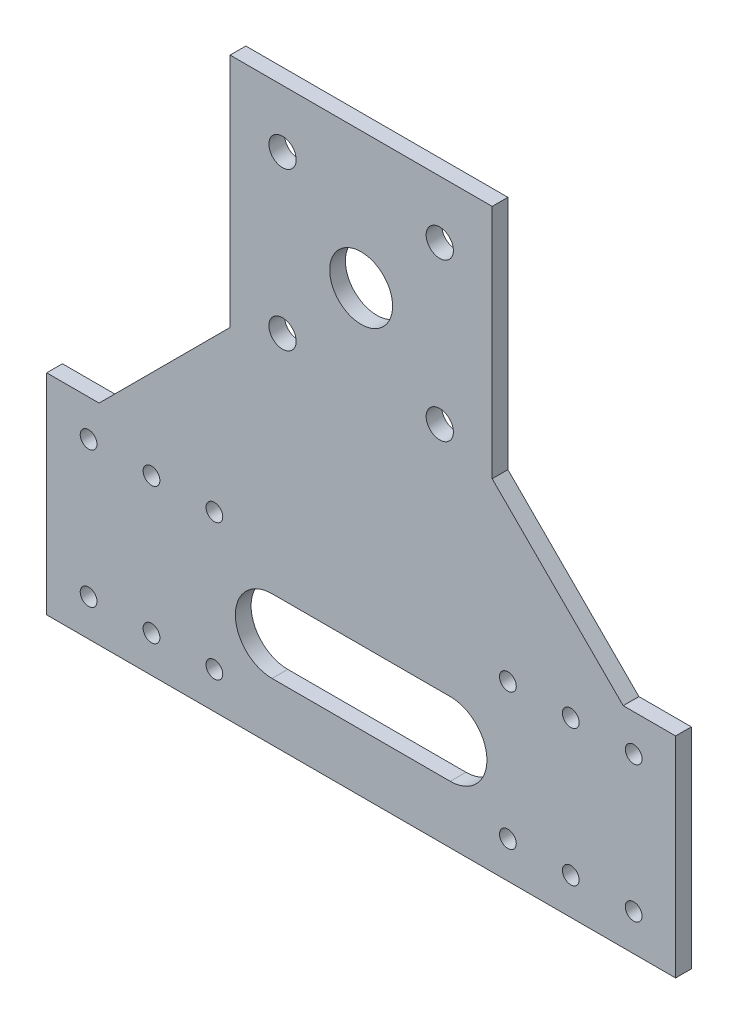
ISO-10303-21;
HEADER;
FILE_DESCRIPTION(('STEP AP214'),'2;1');
FILE_NAME('part.step','',(''),(''),'','','');
FILE_SCHEMA(('AUTOMOTIVE_DESIGN { 1 0 10303 214 1 1 1 1 }'));
ENDSEC;
DATA;
#1=APPLICATION_CONTEXT('core data for automotive mechanical design processes');
#2=APPLICATION_PROTOCOL_DEFINITION('international standard','automotive_design',2000,#1);
#3=PRODUCT_CONTEXT('',#1,'mechanical');
#4=PRODUCT('Part','Part','',(#3));
#5=PRODUCT_RELATED_PRODUCT_CATEGORY('part','',(#4));
#6=PRODUCT_DEFINITION_FORMATION('','',#4);
#7=PRODUCT_DEFINITION_CONTEXT('part definition',#1,'design');
#8=PRODUCT_DEFINITION('design','',#6,#7);
#9=PRODUCT_DEFINITION_SHAPE('','',#8);
#10=(LENGTH_UNIT() NAMED_UNIT(*) SI_UNIT(.MILLI.,.METRE.));
#11=(NAMED_UNIT(*) PLANE_ANGLE_UNIT() SI_UNIT($,.RADIAN.));
#12=(NAMED_UNIT(*) SI_UNIT($,.STERADIAN.) SOLID_ANGLE_UNIT());
#13=UNCERTAINTY_MEASURE_WITH_UNIT(LENGTH_MEASURE(1.E-05),#10,'distance_accuracy_value','');
#14=(GEOMETRIC_REPRESENTATION_CONTEXT(3) GLOBAL_UNCERTAINTY_ASSIGNED_CONTEXT((#13)) GLOBAL_UNIT_ASSIGNED_CONTEXT((#10,
#11,#12)) REPRESENTATION_CONTEXT('',''));
#15=CARTESIAN_POINT('',(0.,0.,0.));
#16=DIRECTION('',(0.,0.,1.));
#17=DIRECTION('',(1.,0.,0.));
#18=AXIS2_PLACEMENT_3D('',#15,#16,#17);
#19=CARTESIAN_POINT('',(120.,0.,3.));
#20=DIRECTION('',(0.,1.,0.));
#21=DIRECTION('',(-1.,0.,0.));
#22=AXIS2_PLACEMENT_3D('',#19,#20,#21);
#23=PLANE('',#22);
#24=DIRECTION('',(1.,0.,0.));
#25=VECTOR('',#24,1.);
#26=CARTESIAN_POINT('',(120.,0.,0.));
#27=LINE('',#26,#25);
#28=CARTESIAN_POINT('',(0.,0.,0.));
#29=VERTEX_POINT('',#28);
#30=CARTESIAN_POINT('',(120.,0.,0.));
#31=VERTEX_POINT('',#30);
#32=EDGE_CURVE('E239',#29,#31,#27,.T.);
#33=ORIENTED_EDGE('',*,*,#32,.T.);
#34=DIRECTION('',(0.,0.,-1.));
#35=VECTOR('',#34,1.);
#36=CARTESIAN_POINT('',(120.,0.,3.));
#37=LINE('',#36,#35);
#38=CARTESIAN_POINT('',(120.,0.,3.));
#39=VERTEX_POINT('',#38);
#40=EDGE_CURVE('E285',#39,#31,#37,.T.);
#41=ORIENTED_EDGE('',*,*,#40,.F.);
#42=DIRECTION('',(1.,0.,0.));
#43=VECTOR('',#42,1.);
#44=CARTESIAN_POINT('',(120.,0.,3.));
#45=LINE('',#44,#43);
#46=CARTESIAN_POINT('',(0.,0.,3.));
#47=VERTEX_POINT('',#46);
#48=EDGE_CURVE('E216',#47,#39,#45,.T.);
#49=ORIENTED_EDGE('',*,*,#48,.F.);
#50=DIRECTION('',(0.,0.,-1.));
#51=VECTOR('',#50,1.);
#52=CARTESIAN_POINT('',(0.,0.,3.));
#53=LINE('',#52,#51);
#54=EDGE_CURVE('E238',#47,#29,#53,.T.);
#55=ORIENTED_EDGE('',*,*,#54,.T.);
#56=EDGE_LOOP('',(#33,#41,#49,#55));
#57=FACE_BOUND('',#56,.T.);
#58=ADVANCED_FACE('F35',(#57),#23,.F.);
#59=CARTESIAN_POINT('',(120.,40.,3.));
#60=DIRECTION('',(-1.,0.,0.));
#61=DIRECTION('',(0.,0.,1.));
#62=AXIS2_PLACEMENT_3D('',#59,#60,#61);
#63=PLANE('',#62);
#64=DIRECTION('',(0.,1.,0.));
#65=VECTOR('',#64,1.);
#66=CARTESIAN_POINT('',(120.,40.,0.));
#67=LINE('',#66,#65);
#68=CARTESIAN_POINT('',(120.,40.,0.));
#69=VERTEX_POINT('',#68);
#70=EDGE_CURVE('E242',#31,#69,#67,.T.);
#71=ORIENTED_EDGE('',*,*,#70,.T.);
#72=DIRECTION('',(0.,0.,-1.));
#73=VECTOR('',#72,1.);
#74=CARTESIAN_POINT('',(120.,40.,3.));
#75=LINE('',#74,#73);
#76=CARTESIAN_POINT('',(120.,40.,3.));
#77=VERTEX_POINT('',#76);
#78=EDGE_CURVE('E282',#77,#69,#75,.T.);
#79=ORIENTED_EDGE('',*,*,#78,.F.);
#80=DIRECTION('',(0.,1.,0.));
#81=VECTOR('',#80,1.);
#82=CARTESIAN_POINT('',(120.,40.,3.));
#83=LINE('',#82,#81);
#84=EDGE_CURVE('E219',#39,#77,#83,.T.);
#85=ORIENTED_EDGE('',*,*,#84,.F.);
#86=ORIENTED_EDGE('',*,*,#40,.T.);
#87=EDGE_LOOP('',(#71,#79,#85,#86));
#88=FACE_BOUND('',#87,.T.);
#89=ADVANCED_FACE('F430',(#88),#63,.F.);
#90=CARTESIAN_POINT('',(110.,40.,3.));
#91=DIRECTION('',(0.,-1.,0.));
#92=DIRECTION('',(1.,0.,0.));
#93=AXIS2_PLACEMENT_3D('',#90,#91,#92);
#94=PLANE('',#93);
#95=DIRECTION('',(-1.,0.,0.));
#96=VECTOR('',#95,1.);
#97=CARTESIAN_POINT('',(110.,40.,0.));
#98=LINE('',#97,#96);
#99=CARTESIAN_POINT('',(110.,40.,0.));
#100=VERTEX_POINT('',#99);
#101=EDGE_CURVE('E244',#69,#100,#98,.T.);
#102=ORIENTED_EDGE('',*,*,#101,.T.);
#103=DIRECTION('',(0.,0.,-1.));
#104=VECTOR('',#103,1.);
#105=CARTESIAN_POINT('',(110.,40.,3.));
#106=LINE('',#105,#104);
#107=CARTESIAN_POINT('',(110.,40.,3.));
#108=VERTEX_POINT('',#107);
#109=EDGE_CURVE('E279',#108,#100,#106,.T.);
#110=ORIENTED_EDGE('',*,*,#109,.F.);
#111=DIRECTION('',(-1.,0.,0.));
#112=VECTOR('',#111,1.);
#113=CARTESIAN_POINT('',(110.,40.,3.));
#114=LINE('',#113,#112);
#115=EDGE_CURVE('E222',#77,#108,#114,.T.);
#116=ORIENTED_EDGE('',*,*,#115,.F.);
#117=ORIENTED_EDGE('',*,*,#78,.T.);
#118=EDGE_LOOP('',(#102,#110,#116,#117));
#119=FACE_BOUND('',#118,.T.);
#120=ADVANCED_FACE('F427',(#119),#94,.F.);
#121=CARTESIAN_POINT('',(85.,65.0000000000001,3.));
#122=DIRECTION('',(-0.707106781186549,-0.707106781186546,0.));
#123=DIRECTION('',(0.707106781186546,-0.707106781186549,0.));
#124=AXIS2_PLACEMENT_3D('',#121,#122,#123);
#125=PLANE('',#124);
#126=DIRECTION('',(-0.707106781186546,0.707106781186549,0.));
#127=VECTOR('',#126,1.);
#128=CARTESIAN_POINT('',(85.,65.0000000000001,0.));
#129=LINE('',#128,#127);
#130=CARTESIAN_POINT('',(85.,65.0000000000001,0.));
#131=VERTEX_POINT('',#130);
#132=EDGE_CURVE('E246',#100,#131,#129,.T.);
#133=ORIENTED_EDGE('',*,*,#132,.T.);
#134=DIRECTION('',(0.,0.,-1.));
#135=VECTOR('',#134,1.);
#136=CARTESIAN_POINT('',(85.,65.0000000000001,3.));
#137=LINE('',#136,#135);
#138=CARTESIAN_POINT('',(85.,65.0000000000001,3.));
#139=VERTEX_POINT('',#138);
#140=EDGE_CURVE('E276',#139,#131,#137,.T.);
#141=ORIENTED_EDGE('',*,*,#140,.F.);
#142=DIRECTION('',(-0.707106781186546,0.707106781186549,0.));
#143=VECTOR('',#142,1.);
#144=CARTESIAN_POINT('',(85.,65.0000000000001,3.));
#145=LINE('',#144,#143);
#146=EDGE_CURVE('E224',#108,#139,#145,.T.);
#147=ORIENTED_EDGE('',*,*,#146,.F.);
#148=ORIENTED_EDGE('',*,*,#109,.T.);
#149=EDGE_LOOP('',(#133,#141,#147,#148));
#150=FACE_BOUND('',#149,.T.);
#151=ADVANCED_FACE('F423',(#150),#125,.F.);
#152=CARTESIAN_POINT('',(85.,110.,3.));
#153=DIRECTION('',(-1.,0.,0.));
#154=DIRECTION('',(0.,0.,1.));
#155=AXIS2_PLACEMENT_3D('',#152,#153,#154);
#156=PLANE('',#155);
#157=DIRECTION('',(0.,1.,0.));
#158=VECTOR('',#157,1.);
#159=CARTESIAN_POINT('',(85.,110.,0.));
#160=LINE('',#159,#158);
#161=CARTESIAN_POINT('',(85.,110.,0.));
#162=VERTEX_POINT('',#161);
#163=EDGE_CURVE('E248',#131,#162,#160,.T.);
#164=ORIENTED_EDGE('',*,*,#163,.T.);
#165=DIRECTION('',(0.,0.,-1.));
#166=VECTOR('',#165,1.);
#167=CARTESIAN_POINT('',(85.,110.,3.));
#168=LINE('',#167,#166);
#169=CARTESIAN_POINT('',(85.,110.,3.));
#170=VERTEX_POINT('',#169);
#171=EDGE_CURVE('E273',#170,#162,#168,.T.);
#172=ORIENTED_EDGE('',*,*,#171,.F.);
#173=DIRECTION('',(0.,1.,0.));
#174=VECTOR('',#173,1.);
#175=CARTESIAN_POINT('',(85.,110.,3.));
#176=LINE('',#175,#174);
#177=EDGE_CURVE('E226',#139,#170,#176,.T.);
#178=ORIENTED_EDGE('',*,*,#177,.F.);
#179=ORIENTED_EDGE('',*,*,#140,.T.);
#180=EDGE_LOOP('',(#164,#172,#178,#179));
#181=FACE_BOUND('',#180,.T.);
#182=ADVANCED_FACE('F418',(#181),#156,.F.);
#183=CARTESIAN_POINT('',(35.,110.,3.));
#184=DIRECTION('',(0.,-1.,0.));
#185=DIRECTION('',(0.,0.,-1.));
#186=AXIS2_PLACEMENT_3D('',#183,#184,#185);
#187=PLANE('',#186);
#188=DIRECTION('',(-1.,0.,0.));
#189=VECTOR('',#188,1.);
#190=CARTESIAN_POINT('',(35.,110.,0.));
#191=LINE('',#190,#189);
#192=CARTESIAN_POINT('',(35.,110.,0.));
#193=VERTEX_POINT('',#192);
#194=EDGE_CURVE('E250',#162,#193,#191,.T.);
#195=ORIENTED_EDGE('',*,*,#194,.T.);
#196=DIRECTION('',(0.,0.,-1.));
#197=VECTOR('',#196,1.);
#198=CARTESIAN_POINT('',(35.,110.,3.));
#199=LINE('',#198,#197);
#200=CARTESIAN_POINT('',(35.,110.,3.));
#201=VERTEX_POINT('',#200);
#202=EDGE_CURVE('E270',#201,#193,#199,.T.);
#203=ORIENTED_EDGE('',*,*,#202,.F.);
#204=DIRECTION('',(-1.,0.,0.));
#205=VECTOR('',#204,1.);
#206=CARTESIAN_POINT('',(35.,110.,3.));
#207=LINE('',#206,#205);
#208=EDGE_CURVE('E228',#170,#201,#207,.T.);
#209=ORIENTED_EDGE('',*,*,#208,.F.);
#210=ORIENTED_EDGE('',*,*,#171,.T.);
#211=EDGE_LOOP('',(#195,#203,#209,#210));
#212=FACE_BOUND('',#211,.T.);
#213=ADVANCED_FACE('F413',(#212),#187,.F.);
#214=CARTESIAN_POINT('',(35.,65.0000000000001,3.));
#215=DIRECTION('',(1.,0.,0.));
#216=DIRECTION('',(0.,0.,-1.));
#217=AXIS2_PLACEMENT_3D('',#214,#215,#216);
#218=PLANE('',#217);
#219=DIRECTION('',(0.,-1.,0.));
#220=VECTOR('',#219,1.);
#221=CARTESIAN_POINT('',(35.,65.0000000000001,0.));
#222=LINE('',#221,#220);
#223=CARTESIAN_POINT('',(35.,65.0000000000001,0.));
#224=VERTEX_POINT('',#223);
#225=EDGE_CURVE('E252',#193,#224,#222,.T.);
#226=ORIENTED_EDGE('',*,*,#225,.T.);
#227=DIRECTION('',(0.,0.,-1.));
#228=VECTOR('',#227,1.);
#229=CARTESIAN_POINT('',(35.,65.0000000000001,3.));
#230=LINE('',#229,#228);
#231=CARTESIAN_POINT('',(35.,65.0000000000001,3.));
#232=VERTEX_POINT('',#231);
#233=EDGE_CURVE('E267',#232,#224,#230,.T.);
#234=ORIENTED_EDGE('',*,*,#233,.F.);
#235=DIRECTION('',(0.,-1.,0.));
#236=VECTOR('',#235,1.);
#237=CARTESIAN_POINT('',(35.,65.0000000000001,3.));
#238=LINE('',#237,#236);
#239=EDGE_CURVE('E230',#201,#232,#238,.T.);
#240=ORIENTED_EDGE('',*,*,#239,.F.);
#241=ORIENTED_EDGE('',*,*,#202,.T.);
#242=EDGE_LOOP('',(#226,#234,#240,#241));
#243=FACE_BOUND('',#242,.T.);
#244=ADVANCED_FACE('F409',(#243),#218,.F.);
#245=CARTESIAN_POINT('',(10.,40.,3.));
#246=DIRECTION('',(0.707106781186549,-0.707106781186546,0.));
#247=DIRECTION('',(0.707106781186546,0.707106781186549,0.));
#248=AXIS2_PLACEMENT_3D('',#245,#246,#247);
#249=PLANE('',#248);
#250=DIRECTION('',(-0.707106781186546,-0.707106781186549,0.));
#251=VECTOR('',#250,1.);
#252=CARTESIAN_POINT('',(10.,40.,0.));
#253=LINE('',#252,#251);
#254=CARTESIAN_POINT('',(10.,40.,0.));
#255=VERTEX_POINT('',#254);
#256=EDGE_CURVE('E254',#224,#255,#253,.T.);
#257=ORIENTED_EDGE('',*,*,#256,.T.);
#258=DIRECTION('',(0.,0.,-1.));
#259=VECTOR('',#258,1.);
#260=CARTESIAN_POINT('',(10.,40.,3.));
#261=LINE('',#260,#259);
#262=CARTESIAN_POINT('',(10.,40.,3.));
#263=VERTEX_POINT('',#262);
#264=EDGE_CURVE('E264',#263,#255,#261,.T.);
#265=ORIENTED_EDGE('',*,*,#264,.F.);
#266=DIRECTION('',(-0.707106781186546,-0.707106781186549,0.));
#267=VECTOR('',#266,1.);
#268=CARTESIAN_POINT('',(10.,40.,3.));
#269=LINE('',#268,#267);
#270=EDGE_CURVE('E232',#232,#263,#269,.T.);
#271=ORIENTED_EDGE('',*,*,#270,.F.);
#272=ORIENTED_EDGE('',*,*,#233,.T.);
#273=EDGE_LOOP('',(#257,#265,#271,#272));
#274=FACE_BOUND('',#273,.T.);
#275=ADVANCED_FACE('F404',(#274),#249,.F.);
#276=CARTESIAN_POINT('',(0.,40.,3.));
#277=DIRECTION('',(0.,-1.,0.));
#278=DIRECTION('',(0.,0.,-1.));
#279=AXIS2_PLACEMENT_3D('',#276,#277,#278);
#280=PLANE('',#279);
#281=DIRECTION('',(-1.,0.,0.));
#282=VECTOR('',#281,1.);
#283=CARTESIAN_POINT('',(0.,40.,0.));
#284=LINE('',#283,#282);
#285=CARTESIAN_POINT('',(0.,40.,0.));
#286=VERTEX_POINT('',#285);
#287=EDGE_CURVE('E256',#255,#286,#284,.T.);
#288=ORIENTED_EDGE('',*,*,#287,.T.);
#289=DIRECTION('',(0.,0.,-1.));
#290=VECTOR('',#289,1.);
#291=CARTESIAN_POINT('',(0.,40.,3.));
#292=LINE('',#291,#290);
#293=CARTESIAN_POINT('',(0.,40.,3.));
#294=VERTEX_POINT('',#293);
#295=EDGE_CURVE('E261',#294,#286,#292,.T.);
#296=ORIENTED_EDGE('',*,*,#295,.F.);
#297=DIRECTION('',(-1.,0.,0.));
#298=VECTOR('',#297,1.);
#299=CARTESIAN_POINT('',(0.,40.,3.));
#300=LINE('',#299,#298);
#301=EDGE_CURVE('E234',#263,#294,#300,.T.);
#302=ORIENTED_EDGE('',*,*,#301,.F.);
#303=ORIENTED_EDGE('',*,*,#264,.T.);
#304=EDGE_LOOP('',(#288,#296,#302,#303));
#305=FACE_BOUND('',#304,.T.);
#306=ADVANCED_FACE('F398',(#305),#280,.F.);
#307=CARTESIAN_POINT('',(0.,0.,3.));
#308=DIRECTION('',(1.,0.,0.));
#309=DIRECTION('',(0.,0.,-1.));
#310=AXIS2_PLACEMENT_3D('',#307,#308,#309);
#311=PLANE('',#310);
#312=DIRECTION('',(0.,-1.,0.));
#313=VECTOR('',#312,1.);
#314=CARTESIAN_POINT('',(0.,0.,0.));
#315=LINE('',#314,#313);
#316=EDGE_CURVE('E220',#286,#29,#315,.T.);
#317=ORIENTED_EDGE('',*,*,#316,.T.);
#318=ORIENTED_EDGE('',*,*,#54,.F.);
#319=DIRECTION('',(0.,-1.,0.));
#320=VECTOR('',#319,1.);
#321=CARTESIAN_POINT('',(0.,0.,3.));
#322=LINE('',#321,#320);
#323=EDGE_CURVE('E236',#294,#47,#322,.T.);
#324=ORIENTED_EDGE('',*,*,#323,.F.);
#325=ORIENTED_EDGE('',*,*,#295,.T.);
#326=EDGE_LOOP('',(#317,#318,#324,#325));
#327=FACE_BOUND('',#326,.T.);
#328=ADVANCED_FACE('F394',(#327),#311,.F.);
#329=CARTESIAN_POINT('',(0.,0.,3.));
#330=DIRECTION('',(0.,0.,-1.));
#331=DIRECTION('',(-1.,0.,0.));
#332=AXIS2_PLACEMENT_3D('',#329,#330,#331);
#333=PLANE('',#332);
#334=CARTESIAN_POINT('',(32.,33.,3.));
#335=DIRECTION('',(0.,0.,1.));
#336=DIRECTION('',(1.,0.,0.));
#337=AXIS2_PLACEMENT_3D('',#334,#335,#336);
#338=CIRCLE('',#337,1.6);
#339=CARTESIAN_POINT('',(33.6,33.,3.));
#340=VERTEX_POINT('',#339);
#341=EDGE_CURVE('E174',#340,#340,#338,.T.);
#342=ORIENTED_EDGE('',*,*,#341,.F.);
#343=EDGE_LOOP('',(#342));
#344=FACE_BOUND('',#343,.T.);
#345=CARTESIAN_POINT('',(100.,7.,3.));
#346=DIRECTION('',(0.,0.,1.));
#347=DIRECTION('',(1.,0.,0.));
#348=AXIS2_PLACEMENT_3D('',#345,#346,#347);
#349=CIRCLE('',#348,1.60000000000001);
#350=CARTESIAN_POINT('',(101.6,7.,3.));
#351=VERTEX_POINT('',#350);
#352=EDGE_CURVE('E177',#351,#351,#349,.T.);
#353=ORIENTED_EDGE('',*,*,#352,.F.);
#354=EDGE_LOOP('',(#353));
#355=FACE_BOUND('',#354,.T.);
#356=CARTESIAN_POINT('',(20.,7.,3.));
#357=DIRECTION('',(0.,0.,1.));
#358=DIRECTION('',(1.,0.,0.));
#359=AXIS2_PLACEMENT_3D('',#356,#357,#358);
#360=CIRCLE('',#359,1.6);
#361=CARTESIAN_POINT('',(21.6,7.,3.));
#362=VERTEX_POINT('',#361);
#363=EDGE_CURVE('E180',#362,#362,#360,.T.);
#364=ORIENTED_EDGE('',*,*,#363,.F.);
#365=EDGE_LOOP('',(#364));
#366=FACE_BOUND('',#365,.T.);
#367=CARTESIAN_POINT('',(100.,33.,3.));
#368=DIRECTION('',(0.,0.,1.));
#369=DIRECTION('',(1.,0.,0.));
#370=AXIS2_PLACEMENT_3D('',#367,#368,#369);
#371=CIRCLE('',#370,1.60000000000001);
#372=CARTESIAN_POINT('',(101.6,33.,3.));
#373=VERTEX_POINT('',#372);
#374=EDGE_CURVE('E183',#373,#373,#371,.T.);
#375=ORIENTED_EDGE('',*,*,#374,.F.);
#376=EDGE_LOOP('',(#375));
#377=FACE_BOUND('',#376,.T.);
#378=CARTESIAN_POINT('',(60.0000000000001,84.,3.));
#379=DIRECTION('',(0.,0.,1.));
#380=DIRECTION('',(1.,0.,0.));
#381=AXIS2_PLACEMENT_3D('',#378,#379,#380);
#382=CIRCLE('',#381,5.99999999999978);
#383=CARTESIAN_POINT('',(65.9999999999999,84.,3.));
#384=VERTEX_POINT('',#383);
#385=EDGE_CURVE('E162',#384,#384,#382,.T.);
#386=ORIENTED_EDGE('',*,*,#385,.F.);
#387=EDGE_LOOP('',(#386));
#388=FACE_BOUND('',#387,.T.);
#389=CARTESIAN_POINT('',(88.,7.,3.));
#390=DIRECTION('',(0.,0.,1.));
#391=DIRECTION('',(1.,0.,0.));
#392=AXIS2_PLACEMENT_3D('',#389,#390,#391);
#393=CIRCLE('',#392,1.60000000000001);
#394=CARTESIAN_POINT('',(89.6,7.,3.));
#395=VERTEX_POINT('',#394);
#396=EDGE_CURVE('E165',#395,#395,#393,.T.);
#397=ORIENTED_EDGE('',*,*,#396,.F.);
#398=EDGE_LOOP('',(#397));
#399=FACE_BOUND('',#398,.T.);
#400=CARTESIAN_POINT('',(88.,33.,3.));
#401=DIRECTION('',(0.,0.,1.));
#402=DIRECTION('',(1.,0.,0.));
#403=AXIS2_PLACEMENT_3D('',#400,#401,#402);
#404=CIRCLE('',#403,1.60000000000001);
#405=CARTESIAN_POINT('',(89.6,33.,3.));
#406=VERTEX_POINT('',#405);
#407=EDGE_CURVE('E168',#406,#406,#404,.T.);
#408=ORIENTED_EDGE('',*,*,#407,.F.);
#409=EDGE_LOOP('',(#408));
#410=FACE_BOUND('',#409,.T.);
#411=CARTESIAN_POINT('',(32.,7.,3.));
#412=DIRECTION('',(0.,0.,1.));
#413=DIRECTION('',(1.,0.,0.));
#414=AXIS2_PLACEMENT_3D('',#411,#412,#413);
#415=CIRCLE('',#414,1.6);
#416=CARTESIAN_POINT('',(33.6,7.,3.));
#417=VERTEX_POINT('',#416);
#418=EDGE_CURVE('E171',#417,#417,#415,.T.);
#419=ORIENTED_EDGE('',*,*,#418,.F.);
#420=EDGE_LOOP('',(#419));
#421=FACE_BOUND('',#420,.T.);
#422=CARTESIAN_POINT('',(75.0000000000002,99.,3.));
#423=DIRECTION('',(0.,0.,1.));
#424=DIRECTION('',(1.,0.,0.));
#425=AXIS2_PLACEMENT_3D('',#422,#423,#424);
#426=CIRCLE('',#425,2.6);
#427=CARTESIAN_POINT('',(77.6000000000002,99.,3.));
#428=VERTEX_POINT('',#427);
#429=EDGE_CURVE('E201',#428,#428,#426,.T.);
#430=ORIENTED_EDGE('',*,*,#429,.F.);
#431=EDGE_LOOP('',(#430));
#432=FACE_BOUND('',#431,.T.);
#433=CARTESIAN_POINT('',(75.0000000000002,69.,3.));
#434=DIRECTION('',(0.,0.,1.));
#435=DIRECTION('',(1.,0.,0.));
#436=AXIS2_PLACEMENT_3D('',#433,#434,#435);
#437=CIRCLE('',#436,2.6);
#438=CARTESIAN_POINT('',(77.6000000000002,69.,3.));
#439=VERTEX_POINT('',#438);
#440=EDGE_CURVE('E205',#439,#439,#437,.T.);
#441=ORIENTED_EDGE('',*,*,#440,.F.);
#442=EDGE_LOOP('',(#441));
#443=FACE_BOUND('',#442,.T.);
#444=CARTESIAN_POINT('',(45.0000000000001,69.,3.));
#445=DIRECTION('',(0.,0.,1.));
#446=DIRECTION('',(1.,0.,0.));
#447=AXIS2_PLACEMENT_3D('',#444,#445,#446);
#448=CIRCLE('',#447,2.6);
#449=CARTESIAN_POINT('',(47.6000000000001,69.,3.));
#450=VERTEX_POINT('',#449);
#451=EDGE_CURVE('E208',#450,#450,#448,.T.);
#452=ORIENTED_EDGE('',*,*,#451,.F.);
#453=EDGE_LOOP('',(#452));
#454=FACE_BOUND('',#453,.T.);
#455=CARTESIAN_POINT('',(8.,33.,3.));
#456=DIRECTION('',(0.,0.,1.));
#457=DIRECTION('',(1.,0.,0.));
#458=AXIS2_PLACEMENT_3D('',#455,#456,#457);
#459=CIRCLE('',#458,1.6);
#460=CARTESIAN_POINT('',(9.6,33.,3.));
#461=VERTEX_POINT('',#460);
#462=EDGE_CURVE('E198',#461,#461,#459,.T.);
#463=ORIENTED_EDGE('',*,*,#462,.F.);
#464=EDGE_LOOP('',(#463));
#465=FACE_BOUND('',#464,.T.);
#466=CARTESIAN_POINT('',(20.,33.,3.));
#467=DIRECTION('',(0.,0.,1.));
#468=DIRECTION('',(1.,0.,0.));
#469=AXIS2_PLACEMENT_3D('',#466,#467,#468);
#470=CIRCLE('',#469,1.6);
#471=CARTESIAN_POINT('',(21.6,33.,3.));
#472=VERTEX_POINT('',#471);
#473=EDGE_CURVE('E186',#472,#472,#470,.T.);
#474=ORIENTED_EDGE('',*,*,#473,.F.);
#475=EDGE_LOOP('',(#474));
#476=FACE_BOUND('',#475,.T.);
#477=CARTESIAN_POINT('',(112.,7.,3.));
#478=DIRECTION('',(0.,0.,1.));
#479=DIRECTION('',(1.,0.,0.));
#480=AXIS2_PLACEMENT_3D('',#477,#478,#479);
#481=CIRCLE('',#480,1.60000000000001);
#482=CARTESIAN_POINT('',(113.6,7.,3.));
#483=VERTEX_POINT('',#482);
#484=EDGE_CURVE('E189',#483,#483,#481,.T.);
#485=ORIENTED_EDGE('',*,*,#484,.F.);
#486=EDGE_LOOP('',(#485));
#487=FACE_BOUND('',#486,.T.);
#488=CARTESIAN_POINT('',(112.,33.,3.));
#489=DIRECTION('',(0.,0.,1.));
#490=DIRECTION('',(1.,0.,0.));
#491=AXIS2_PLACEMENT_3D('',#488,#489,#490);
#492=CIRCLE('',#491,1.60000000000001);
#493=CARTESIAN_POINT('',(113.6,33.,3.));
#494=VERTEX_POINT('',#493);
#495=EDGE_CURVE('E192',#494,#494,#492,.T.);
#496=ORIENTED_EDGE('',*,*,#495,.F.);
#497=EDGE_LOOP('',(#496));
#498=FACE_BOUND('',#497,.T.);
#499=CARTESIAN_POINT('',(8.,7.,3.));
#500=DIRECTION('',(0.,0.,1.));
#501=DIRECTION('',(1.,0.,0.));
#502=AXIS2_PLACEMENT_3D('',#499,#500,#501);
#503=CIRCLE('',#502,1.6);
#504=CARTESIAN_POINT('',(9.60000000000001,7.,3.));
#505=VERTEX_POINT('',#504);
#506=EDGE_CURVE('E195',#505,#505,#503,.T.);
#507=ORIENTED_EDGE('',*,*,#506,.F.);
#508=EDGE_LOOP('',(#507));
#509=FACE_BOUND('',#508,.T.);
#510=DIRECTION('',(1.,0.,0.));
#511=VECTOR('',#510,1.);
#512=CARTESIAN_POINT('',(43.,11.,3.));
#513=LINE('',#512,#511);
#514=CARTESIAN_POINT('',(43.,11.,3.));
#515=VERTEX_POINT('',#514);
#516=CARTESIAN_POINT('',(77.,11.,3.));
#517=VERTEX_POINT('',#516);
#518=EDGE_CURVE('E148',#515,#517,#513,.T.);
#519=ORIENTED_EDGE('',*,*,#518,.F.);
#520=CARTESIAN_POINT('',(43.,18.,3.));
#521=DIRECTION('',(0.,0.,1.));
#522=DIRECTION('',(1.,0.,0.));
#523=AXIS2_PLACEMENT_3D('',#520,#521,#522);
#524=CIRCLE('',#523,7.);
#525=CARTESIAN_POINT('',(43.,25.,3.));
#526=VERTEX_POINT('',#525);
#527=EDGE_CURVE('E51',#526,#515,#524,.T.);
#528=ORIENTED_EDGE('',*,*,#527,.F.);
#529=DIRECTION('',(-1.,0.,0.));
#530=VECTOR('',#529,1.);
#531=CARTESIAN_POINT('',(43.,25.,3.));
#532=LINE('',#531,#530);
#533=CARTESIAN_POINT('',(77.,25.,3.));
#534=VERTEX_POINT('',#533);
#535=EDGE_CURVE('E155',#534,#526,#532,.T.);
#536=ORIENTED_EDGE('',*,*,#535,.F.);
#537=CARTESIAN_POINT('',(77.,18.,3.));
#538=DIRECTION('',(0.,0.,1.));
#539=DIRECTION('',(1.,0.,0.));
#540=AXIS2_PLACEMENT_3D('',#537,#538,#539);
#541=CIRCLE('',#540,7.);
#542=EDGE_CURVE('E139',#517,#534,#541,.T.);
#543=ORIENTED_EDGE('',*,*,#542,.F.);
#544=EDGE_LOOP('',(#519,#528,#536,#543));
#545=FACE_BOUND('',#544,.T.);
#546=CARTESIAN_POINT('',(45.0000000000001,99.,3.));
#547=DIRECTION('',(0.,0.,1.));
#548=DIRECTION('',(1.,0.,0.));
#549=AXIS2_PLACEMENT_3D('',#546,#547,#548);
#550=CIRCLE('',#549,2.6);
#551=CARTESIAN_POINT('',(47.6000000000001,99.,3.));
#552=VERTEX_POINT('',#551);
#553=EDGE_CURVE('E204',#552,#552,#550,.T.);
#554=ORIENTED_EDGE('',*,*,#553,.F.);
#555=EDGE_LOOP('',(#554));
#556=FACE_BOUND('',#555,.T.);
#557=ORIENTED_EDGE('',*,*,#48,.T.);
#558=ORIENTED_EDGE('',*,*,#84,.T.);
#559=ORIENTED_EDGE('',*,*,#115,.T.);
#560=ORIENTED_EDGE('',*,*,#146,.T.);
#561=ORIENTED_EDGE('',*,*,#177,.T.);
#562=ORIENTED_EDGE('',*,*,#208,.T.);
#563=ORIENTED_EDGE('',*,*,#239,.T.);
#564=ORIENTED_EDGE('',*,*,#270,.T.);
#565=ORIENTED_EDGE('',*,*,#301,.T.);
#566=ORIENTED_EDGE('',*,*,#323,.T.);
#567=EDGE_LOOP('',(#557,#558,#559,#560,#561,#562,#563,#564,#565,#566));
#568=FACE_BOUND('',#567,.T.);
#569=ADVANCED_FACE('F152',(#344,#355,#366,#377,#388,#399,#410,#421,#432,#443,#454,#465,#476,
#487,#498,#509,#545,#556,#568),#333,.F.);
#570=CARTESIAN_POINT('',(0.,0.,0.));
#571=DIRECTION('',(0.,0.,-1.));
#572=DIRECTION('',(-1.,0.,0.));
#573=AXIS2_PLACEMENT_3D('',#570,#571,#572);
#574=PLANE('',#573);
#575=CARTESIAN_POINT('',(32.,33.,0.));
#576=DIRECTION('',(0.,0.,-1.));
#577=DIRECTION('',(-1.,0.,0.));
#578=AXIS2_PLACEMENT_3D('',#575,#576,#577);
#579=CIRCLE('',#578,1.6);
#580=CARTESIAN_POINT('',(30.4,33.,0.));
#581=VERTEX_POINT('',#580);
#582=EDGE_CURVE('E38',#581,#581,#579,.T.);
#583=ORIENTED_EDGE('',*,*,#582,.F.);
#584=EDGE_LOOP('',(#583));
#585=FACE_BOUND('',#584,.T.);
#586=CARTESIAN_POINT('',(100.,7.,0.));
#587=DIRECTION('',(0.,0.,-1.));
#588=DIRECTION('',(-1.,0.,0.));
#589=AXIS2_PLACEMENT_3D('',#586,#587,#588);
#590=CIRCLE('',#589,1.60000000000001);
#591=CARTESIAN_POINT('',(98.4,7.,0.));
#592=VERTEX_POINT('',#591);
#593=EDGE_CURVE('E335',#592,#592,#590,.T.);
#594=ORIENTED_EDGE('',*,*,#593,.F.);
#595=EDGE_LOOP('',(#594));
#596=FACE_BOUND('',#595,.T.);
#597=CARTESIAN_POINT('',(20.,7.,0.));
#598=DIRECTION('',(0.,0.,-1.));
#599=DIRECTION('',(-1.,0.,0.));
#600=AXIS2_PLACEMENT_3D('',#597,#598,#599);
#601=CIRCLE('',#600,1.6);
#602=CARTESIAN_POINT('',(18.4,7.,0.));
#603=VERTEX_POINT('',#602);
#604=EDGE_CURVE('E333',#603,#603,#601,.T.);
#605=ORIENTED_EDGE('',*,*,#604,.F.);
#606=EDGE_LOOP('',(#605));
#607=FACE_BOUND('',#606,.T.);
#608=CARTESIAN_POINT('',(100.,33.,0.));
#609=DIRECTION('',(0.,0.,-1.));
#610=DIRECTION('',(-1.,0.,0.));
#611=AXIS2_PLACEMENT_3D('',#608,#609,#610);
#612=CIRCLE('',#611,1.60000000000001);
#613=CARTESIAN_POINT('',(98.4,33.,0.));
#614=VERTEX_POINT('',#613);
#615=EDGE_CURVE('E330',#614,#614,#612,.T.);
#616=ORIENTED_EDGE('',*,*,#615,.F.);
#617=EDGE_LOOP('',(#616));
#618=FACE_BOUND('',#617,.T.);
#619=CARTESIAN_POINT('',(60.0000000000001,84.,0.));
#620=DIRECTION('',(0.,0.,-1.));
#621=DIRECTION('',(-1.,0.,0.));
#622=AXIS2_PLACEMENT_3D('',#619,#620,#621);
#623=CIRCLE('',#622,5.99999999999978);
#624=CARTESIAN_POINT('',(54.0000000000004,84.,0.));
#625=VERTEX_POINT('',#624);
#626=EDGE_CURVE('E327',#625,#625,#623,.T.);
#627=ORIENTED_EDGE('',*,*,#626,.F.);
#628=EDGE_LOOP('',(#627));
#629=FACE_BOUND('',#628,.T.);
#630=CARTESIAN_POINT('',(88.,7.,0.));
#631=DIRECTION('',(0.,0.,-1.));
#632=DIRECTION('',(-1.,0.,0.));
#633=AXIS2_PLACEMENT_3D('',#630,#631,#632);
#634=CIRCLE('',#633,1.60000000000001);
#635=CARTESIAN_POINT('',(86.4,7.,0.));
#636=VERTEX_POINT('',#635);
#637=EDGE_CURVE('E324',#636,#636,#634,.T.);
#638=ORIENTED_EDGE('',*,*,#637,.F.);
#639=EDGE_LOOP('',(#638));
#640=FACE_BOUND('',#639,.T.);
#641=CARTESIAN_POINT('',(88.,33.,0.));
#642=DIRECTION('',(0.,0.,-1.));
#643=DIRECTION('',(-1.,0.,0.));
#644=AXIS2_PLACEMENT_3D('',#641,#642,#643);
#645=CIRCLE('',#644,1.60000000000001);
#646=CARTESIAN_POINT('',(86.4,33.,0.));
#647=VERTEX_POINT('',#646);
#648=EDGE_CURVE('E321',#647,#647,#645,.T.);
#649=ORIENTED_EDGE('',*,*,#648,.F.);
#650=EDGE_LOOP('',(#649));
#651=FACE_BOUND('',#650,.T.);
#652=CARTESIAN_POINT('',(32.,7.,0.));
#653=DIRECTION('',(0.,0.,-1.));
#654=DIRECTION('',(-1.,0.,0.));
#655=AXIS2_PLACEMENT_3D('',#652,#653,#654);
#656=CIRCLE('',#655,1.6);
#657=CARTESIAN_POINT('',(30.4,7.,0.));
#658=VERTEX_POINT('',#657);
#659=EDGE_CURVE('E318',#658,#658,#656,.T.);
#660=ORIENTED_EDGE('',*,*,#659,.F.);
#661=EDGE_LOOP('',(#660));
#662=FACE_BOUND('',#661,.T.);
#663=CARTESIAN_POINT('',(75.0000000000002,99.,0.));
#664=DIRECTION('',(0.,0.,-1.));
#665=DIRECTION('',(-1.,0.,0.));
#666=AXIS2_PLACEMENT_3D('',#663,#664,#665);
#667=CIRCLE('',#666,2.6);
#668=CARTESIAN_POINT('',(72.4000000000001,99.,0.));
#669=VERTEX_POINT('',#668);
#670=EDGE_CURVE('E315',#669,#669,#667,.T.);
#671=ORIENTED_EDGE('',*,*,#670,.F.);
#672=EDGE_LOOP('',(#671));
#673=FACE_BOUND('',#672,.T.);
#674=CARTESIAN_POINT('',(75.0000000000002,69.,0.));
#675=DIRECTION('',(0.,0.,-1.));
#676=DIRECTION('',(-1.,0.,0.));
#677=AXIS2_PLACEMENT_3D('',#674,#675,#676);
#678=CIRCLE('',#677,2.6);
#679=CARTESIAN_POINT('',(72.4000000000001,69.,0.));
#680=VERTEX_POINT('',#679);
#681=EDGE_CURVE('E312',#680,#680,#678,.T.);
#682=ORIENTED_EDGE('',*,*,#681,.F.);
#683=EDGE_LOOP('',(#682));
#684=FACE_BOUND('',#683,.T.);
#685=CARTESIAN_POINT('',(45.0000000000001,69.,0.));
#686=DIRECTION('',(0.,0.,-1.));
#687=DIRECTION('',(-1.,0.,0.));
#688=AXIS2_PLACEMENT_3D('',#685,#686,#687);
#689=CIRCLE('',#688,2.6);
#690=CARTESIAN_POINT('',(42.4000000000001,69.,0.));
#691=VERTEX_POINT('',#690);
#692=EDGE_CURVE('E309',#691,#691,#689,.T.);
#693=ORIENTED_EDGE('',*,*,#692,.F.);
#694=EDGE_LOOP('',(#693));
#695=FACE_BOUND('',#694,.T.);
#696=CARTESIAN_POINT('',(8.,33.,0.));
#697=DIRECTION('',(0.,0.,-1.));
#698=DIRECTION('',(-1.,0.,0.));
#699=AXIS2_PLACEMENT_3D('',#696,#697,#698);
#700=CIRCLE('',#699,1.6);
#701=CARTESIAN_POINT('',(6.4,33.,0.));
#702=VERTEX_POINT('',#701);
#703=EDGE_CURVE('E306',#702,#702,#700,.T.);
#704=ORIENTED_EDGE('',*,*,#703,.F.);
#705=EDGE_LOOP('',(#704));
#706=FACE_BOUND('',#705,.T.);
#707=CARTESIAN_POINT('',(20.,33.,0.));
#708=DIRECTION('',(0.,0.,-1.));
#709=DIRECTION('',(-1.,0.,0.));
#710=AXIS2_PLACEMENT_3D('',#707,#708,#709);
#711=CIRCLE('',#710,1.6);
#712=CARTESIAN_POINT('',(18.4,33.,0.));
#713=VERTEX_POINT('',#712);
#714=EDGE_CURVE('E303',#713,#713,#711,.T.);
#715=ORIENTED_EDGE('',*,*,#714,.F.);
#716=EDGE_LOOP('',(#715));
#717=FACE_BOUND('',#716,.T.);
#718=CARTESIAN_POINT('',(112.,7.,0.));
#719=DIRECTION('',(0.,0.,-1.));
#720=DIRECTION('',(-1.,0.,0.));
#721=AXIS2_PLACEMENT_3D('',#718,#719,#720);
#722=CIRCLE('',#721,1.60000000000001);
#723=CARTESIAN_POINT('',(110.4,7.,0.));
#724=VERTEX_POINT('',#723);
#725=EDGE_CURVE('E300',#724,#724,#722,.T.);
#726=ORIENTED_EDGE('',*,*,#725,.F.);
#727=EDGE_LOOP('',(#726));
#728=FACE_BOUND('',#727,.T.);
#729=CARTESIAN_POINT('',(112.,33.,0.));
#730=DIRECTION('',(0.,0.,-1.));
#731=DIRECTION('',(-1.,0.,0.));
#732=AXIS2_PLACEMENT_3D('',#729,#730,#731);
#733=CIRCLE('',#732,1.60000000000001);
#734=CARTESIAN_POINT('',(110.4,33.,0.));
#735=VERTEX_POINT('',#734);
#736=EDGE_CURVE('E297',#735,#735,#733,.T.);
#737=ORIENTED_EDGE('',*,*,#736,.F.);
#738=EDGE_LOOP('',(#737));
#739=FACE_BOUND('',#738,.T.);
#740=CARTESIAN_POINT('',(8.,7.,0.));
#741=DIRECTION('',(0.,0.,-1.));
#742=DIRECTION('',(-1.,0.,0.));
#743=AXIS2_PLACEMENT_3D('',#740,#741,#742);
#744=CIRCLE('',#743,1.6);
#745=CARTESIAN_POINT('',(6.4,7.,0.));
#746=VERTEX_POINT('',#745);
#747=EDGE_CURVE('E291',#746,#746,#744,.T.);
#748=ORIENTED_EDGE('',*,*,#747,.F.);
#749=EDGE_LOOP('',(#748));
#750=FACE_BOUND('',#749,.T.);
#751=CARTESIAN_POINT('',(43.,18.,0.));
#752=DIRECTION('',(0.,0.,-1.));
#753=DIRECTION('',(-1.,0.,0.));
#754=AXIS2_PLACEMENT_3D('',#751,#752,#753);
#755=CIRCLE('',#754,7.);
#756=CARTESIAN_POINT('',(43.,11.,0.));
#757=VERTEX_POINT('',#756);
#758=CARTESIAN_POINT('',(43.,25.,0.));
#759=VERTEX_POINT('',#758);
#760=EDGE_CURVE('E11',#757,#759,#755,.T.);
#761=ORIENTED_EDGE('',*,*,#760,.F.);
#762=DIRECTION('',(-1.,0.,0.));
#763=VECTOR('',#762,1.);
#764=CARTESIAN_POINT('',(0.,11.,0.));
#765=LINE('',#764,#763);
#766=CARTESIAN_POINT('',(77.,11.,0.));
#767=VERTEX_POINT('',#766);
#768=EDGE_CURVE('E288',#767,#757,#765,.T.);
#769=ORIENTED_EDGE('',*,*,#768,.F.);
#770=CARTESIAN_POINT('',(77.,18.,0.));
#771=DIRECTION('',(0.,0.,-1.));
#772=DIRECTION('',(-1.,0.,0.));
#773=AXIS2_PLACEMENT_3D('',#770,#771,#772);
#774=CIRCLE('',#773,7.);
#775=CARTESIAN_POINT('',(77.,25.,0.));
#776=VERTEX_POINT('',#775);
#777=EDGE_CURVE('E142',#776,#767,#774,.T.);
#778=ORIENTED_EDGE('',*,*,#777,.F.);
#779=DIRECTION('',(1.,0.,0.));
#780=VECTOR('',#779,1.);
#781=CARTESIAN_POINT('',(0.,25.,0.));
#782=LINE('',#781,#780);
#783=EDGE_CURVE('E43',#759,#776,#782,.T.);
#784=ORIENTED_EDGE('',*,*,#783,.F.);
#785=EDGE_LOOP('',(#761,#769,#778,#784));
#786=FACE_BOUND('',#785,.T.);
#787=CARTESIAN_POINT('',(45.0000000000001,99.,0.));
#788=DIRECTION('',(0.,0.,-1.));
#789=DIRECTION('',(-1.,0.,0.));
#790=AXIS2_PLACEMENT_3D('',#787,#788,#789);
#791=CIRCLE('',#790,2.6);
#792=CARTESIAN_POINT('',(42.4000000000001,99.,0.));
#793=VERTEX_POINT('',#792);
#794=EDGE_CURVE('E215',#793,#793,#791,.T.);
#795=ORIENTED_EDGE('',*,*,#794,.F.);
#796=EDGE_LOOP('',(#795));
#797=FACE_BOUND('',#796,.T.);
#798=ORIENTED_EDGE('',*,*,#32,.F.);
#799=ORIENTED_EDGE('',*,*,#316,.F.);
#800=ORIENTED_EDGE('',*,*,#287,.F.);
#801=ORIENTED_EDGE('',*,*,#256,.F.);
#802=ORIENTED_EDGE('',*,*,#225,.F.);
#803=ORIENTED_EDGE('',*,*,#194,.F.);
#804=ORIENTED_EDGE('',*,*,#163,.F.);
#805=ORIENTED_EDGE('',*,*,#132,.F.);
#806=ORIENTED_EDGE('',*,*,#101,.F.);
#807=ORIENTED_EDGE('',*,*,#70,.F.);
#808=EDGE_LOOP('',(#798,#799,#800,#801,#802,#803,#804,#805,#806,#807));
#809=FACE_BOUND('',#808,.T.);
#810=ADVANCED_FACE('F345',(#585,#596,#607,#618,#629,#640,#651,#662,#673,#684,#695,#706,#717,
#728,#739,#750,#786,#797,#809),#574,.T.);
#811=CARTESIAN_POINT('',(45.0000000000001,99.,-7.));
#812=DIRECTION('',(0.,0.,1.));
#813=DIRECTION('',(1.,0.,0.));
#814=AXIS2_PLACEMENT_3D('',#811,#812,#813);
#815=CYLINDRICAL_SURFACE('',#814,2.6);
#816=ORIENTED_EDGE('',*,*,#794,.T.);
#817=EDGE_LOOP('',(#816));
#818=FACE_BOUND('',#817,.T.);
#819=ORIENTED_EDGE('',*,*,#553,.T.);
#820=EDGE_LOOP('',(#819));
#821=FACE_BOUND('',#820,.T.);
#822=ADVANCED_FACE('F348',(#818,#821),#815,.F.);
#823=CARTESIAN_POINT('',(43.,18.,-7.));
#824=DIRECTION('',(0.,0.,1.));
#825=DIRECTION('',(1.,0.,0.));
#826=AXIS2_PLACEMENT_3D('',#823,#824,#825);
#827=CYLINDRICAL_SURFACE('',#826,7.);
#828=ORIENTED_EDGE('',*,*,#760,.T.);
#829=DIRECTION('',(0.,0.,1.));
#830=VECTOR('',#829,1.);
#831=CARTESIAN_POINT('',(43.,25.,-7.));
#832=LINE('',#831,#830);
#833=EDGE_CURVE('E160',#759,#526,#832,.T.);
#834=ORIENTED_EDGE('',*,*,#833,.T.);
#835=ORIENTED_EDGE('',*,*,#527,.T.);
#836=DIRECTION('',(0.,0.,1.));
#837=VECTOR('',#836,1.);
#838=CARTESIAN_POINT('',(43.,11.,-7.));
#839=LINE('',#838,#837);
#840=EDGE_CURVE('E145',#757,#515,#839,.T.);
#841=ORIENTED_EDGE('',*,*,#840,.F.);
#842=EDGE_LOOP('',(#828,#834,#835,#841));
#843=FACE_BOUND('',#842,.T.);
#844=ADVANCED_FACE('F489',(#843),#827,.F.);
#845=CARTESIAN_POINT('',(43.,25.,-7.));
#846=DIRECTION('',(0.,1.,0.));
#847=DIRECTION('',(0.,0.,1.));
#848=AXIS2_PLACEMENT_3D('',#845,#846,#847);
#849=PLANE('',#848);
#850=ORIENTED_EDGE('',*,*,#783,.T.);
#851=DIRECTION('',(0.,0.,1.));
#852=VECTOR('',#851,1.);
#853=CARTESIAN_POINT('',(77.,25.,-7.));
#854=LINE('',#853,#852);
#855=EDGE_CURVE('E144',#776,#534,#854,.T.);
#856=ORIENTED_EDGE('',*,*,#855,.T.);
#857=ORIENTED_EDGE('',*,*,#535,.T.);
#858=ORIENTED_EDGE('',*,*,#833,.F.);
#859=EDGE_LOOP('',(#850,#856,#857,#858));
#860=FACE_BOUND('',#859,.T.);
#861=ADVANCED_FACE('F498',(#860),#849,.F.);
#862=CARTESIAN_POINT('',(77.,18.,-7.));
#863=DIRECTION('',(0.,0.,1.));
#864=DIRECTION('',(1.,0.,0.));
#865=AXIS2_PLACEMENT_3D('',#862,#863,#864);
#866=CYLINDRICAL_SURFACE('',#865,7.);
#867=ORIENTED_EDGE('',*,*,#777,.T.);
#868=DIRECTION('',(0.,0.,1.));
#869=VECTOR('',#868,1.);
#870=CARTESIAN_POINT('',(77.,11.,-7.));
#871=LINE('',#870,#869);
#872=EDGE_CURVE('E59',#767,#517,#871,.T.);
#873=ORIENTED_EDGE('',*,*,#872,.T.);
#874=ORIENTED_EDGE('',*,*,#542,.T.);
#875=ORIENTED_EDGE('',*,*,#855,.F.);
#876=EDGE_LOOP('',(#867,#873,#874,#875));
#877=FACE_BOUND('',#876,.T.);
#878=ADVANCED_FACE('F136',(#877),#866,.F.);
#879=CARTESIAN_POINT('',(43.,11.,-7.));
#880=DIRECTION('',(0.,-1.,0.));
#881=DIRECTION('',(0.,0.,-1.));
#882=AXIS2_PLACEMENT_3D('',#879,#880,#881);
#883=PLANE('',#882);
#884=ORIENTED_EDGE('',*,*,#768,.T.);
#885=ORIENTED_EDGE('',*,*,#840,.T.);
#886=ORIENTED_EDGE('',*,*,#518,.T.);
#887=ORIENTED_EDGE('',*,*,#872,.F.);
#888=EDGE_LOOP('',(#884,#885,#886,#887));
#889=FACE_BOUND('',#888,.T.);
#890=ADVANCED_FACE('F149',(#889),#883,.F.);
#891=CARTESIAN_POINT('',(8.,7.,-7.));
#892=DIRECTION('',(0.,0.,1.));
#893=DIRECTION('',(1.,0.,0.));
#894=AXIS2_PLACEMENT_3D('',#891,#892,#893);
#895=CYLINDRICAL_SURFACE('',#894,1.6);
#896=ORIENTED_EDGE('',*,*,#747,.T.);
#897=EDGE_LOOP('',(#896));
#898=FACE_BOUND('',#897,.T.);
#899=ORIENTED_EDGE('',*,*,#506,.T.);
#900=EDGE_LOOP('',(#899));
#901=FACE_BOUND('',#900,.T.);
#902=ADVANCED_FACE('F524',(#898,#901),#895,.F.);
#903=CARTESIAN_POINT('',(112.,33.,-7.));
#904=DIRECTION('',(0.,0.,1.));
#905=DIRECTION('',(1.,0.,0.));
#906=AXIS2_PLACEMENT_3D('',#903,#904,#905);
#907=CYLINDRICAL_SURFACE('',#906,1.60000000000001);
#908=ORIENTED_EDGE('',*,*,#736,.T.);
#909=EDGE_LOOP('',(#908));
#910=FACE_BOUND('',#909,.T.);
#911=ORIENTED_EDGE('',*,*,#495,.T.);
#912=EDGE_LOOP('',(#911));
#913=FACE_BOUND('',#912,.T.);
#914=ADVANCED_FACE('F533',(#910,#913),#907,.F.);
#915=CARTESIAN_POINT('',(112.,7.,-7.));
#916=DIRECTION('',(0.,0.,1.));
#917=DIRECTION('',(1.,0.,0.));
#918=AXIS2_PLACEMENT_3D('',#915,#916,#917);
#919=CYLINDRICAL_SURFACE('',#918,1.60000000000001);
#920=ORIENTED_EDGE('',*,*,#725,.T.);
#921=EDGE_LOOP('',(#920));
#922=FACE_BOUND('',#921,.T.);
#923=ORIENTED_EDGE('',*,*,#484,.T.);
#924=EDGE_LOOP('',(#923));
#925=FACE_BOUND('',#924,.T.);
#926=ADVANCED_FACE('F543',(#922,#925),#919,.F.);
#927=CARTESIAN_POINT('',(20.,33.,-7.));
#928=DIRECTION('',(0.,0.,1.));
#929=DIRECTION('',(1.,0.,0.));
#930=AXIS2_PLACEMENT_3D('',#927,#928,#929);
#931=CYLINDRICAL_SURFACE('',#930,1.6);
#932=ORIENTED_EDGE('',*,*,#714,.T.);
#933=EDGE_LOOP('',(#932));
#934=FACE_BOUND('',#933,.T.);
#935=ORIENTED_EDGE('',*,*,#473,.T.);
#936=EDGE_LOOP('',(#935));
#937=FACE_BOUND('',#936,.T.);
#938=ADVANCED_FACE('F553',(#934,#937),#931,.F.);
#939=CARTESIAN_POINT('',(8.,33.,-7.));
#940=DIRECTION('',(0.,0.,1.));
#941=DIRECTION('',(1.,0.,0.));
#942=AXIS2_PLACEMENT_3D('',#939,#940,#941);
#943=CYLINDRICAL_SURFACE('',#942,1.6);
#944=ORIENTED_EDGE('',*,*,#703,.T.);
#945=EDGE_LOOP('',(#944));
#946=FACE_BOUND('',#945,.T.);
#947=ORIENTED_EDGE('',*,*,#462,.T.);
#948=EDGE_LOOP('',(#947));
#949=FACE_BOUND('',#948,.T.);
#950=ADVANCED_FACE('F563',(#946,#949),#943,.F.);
#951=CARTESIAN_POINT('',(45.0000000000001,69.,-7.));
#952=DIRECTION('',(0.,0.,1.));
#953=DIRECTION('',(1.,0.,0.));
#954=AXIS2_PLACEMENT_3D('',#951,#952,#953);
#955=CYLINDRICAL_SURFACE('',#954,2.6);
#956=ORIENTED_EDGE('',*,*,#692,.T.);
#957=EDGE_LOOP('',(#956));
#958=FACE_BOUND('',#957,.T.);
#959=ORIENTED_EDGE('',*,*,#451,.T.);
#960=EDGE_LOOP('',(#959));
#961=FACE_BOUND('',#960,.T.);
#962=ADVANCED_FACE('F573',(#958,#961),#955,.F.);
#963=CARTESIAN_POINT('',(75.0000000000002,69.,-7.));
#964=DIRECTION('',(0.,0.,1.));
#965=DIRECTION('',(1.,0.,0.));
#966=AXIS2_PLACEMENT_3D('',#963,#964,#965);
#967=CYLINDRICAL_SURFACE('',#966,2.6);
#968=ORIENTED_EDGE('',*,*,#681,.T.);
#969=EDGE_LOOP('',(#968));
#970=FACE_BOUND('',#969,.T.);
#971=ORIENTED_EDGE('',*,*,#440,.T.);
#972=EDGE_LOOP('',(#971));
#973=FACE_BOUND('',#972,.T.);
#974=ADVANCED_FACE('F583',(#970,#973),#967,.F.);
#975=CARTESIAN_POINT('',(75.0000000000002,99.,-7.));
#976=DIRECTION('',(0.,0.,1.));
#977=DIRECTION('',(1.,0.,0.));
#978=AXIS2_PLACEMENT_3D('',#975,#976,#977);
#979=CYLINDRICAL_SURFACE('',#978,2.6);
#980=ORIENTED_EDGE('',*,*,#670,.T.);
#981=EDGE_LOOP('',(#980));
#982=FACE_BOUND('',#981,.T.);
#983=ORIENTED_EDGE('',*,*,#429,.T.);
#984=EDGE_LOOP('',(#983));
#985=FACE_BOUND('',#984,.T.);
#986=ADVANCED_FACE('F593',(#982,#985),#979,.F.);
#987=CARTESIAN_POINT('',(32.,7.,-7.));
#988=DIRECTION('',(0.,0.,1.));
#989=DIRECTION('',(1.,0.,0.));
#990=AXIS2_PLACEMENT_3D('',#987,#988,#989);
#991=CYLINDRICAL_SURFACE('',#990,1.6);
#992=ORIENTED_EDGE('',*,*,#659,.T.);
#993=EDGE_LOOP('',(#992));
#994=FACE_BOUND('',#993,.T.);
#995=ORIENTED_EDGE('',*,*,#418,.T.);
#996=EDGE_LOOP('',(#995));
#997=FACE_BOUND('',#996,.T.);
#998=ADVANCED_FACE('F603',(#994,#997),#991,.F.);
#999=CARTESIAN_POINT('',(88.,33.,-7.));
#1000=DIRECTION('',(0.,0.,1.));
#1001=DIRECTION('',(1.,0.,0.));
#1002=AXIS2_PLACEMENT_3D('',#999,#1000,#1001);
#1003=CYLINDRICAL_SURFACE('',#1002,1.60000000000001);
#1004=ORIENTED_EDGE('',*,*,#648,.T.);
#1005=EDGE_LOOP('',(#1004));
#1006=FACE_BOUND('',#1005,.T.);
#1007=ORIENTED_EDGE('',*,*,#407,.T.);
#1008=EDGE_LOOP('',(#1007));
#1009=FACE_BOUND('',#1008,.T.);
#1010=ADVANCED_FACE('F613',(#1006,#1009),#1003,.F.);
#1011=CARTESIAN_POINT('',(88.,7.,-7.));
#1012=DIRECTION('',(0.,0.,1.));
#1013=DIRECTION('',(1.,0.,0.));
#1014=AXIS2_PLACEMENT_3D('',#1011,#1012,#1013);
#1015=CYLINDRICAL_SURFACE('',#1014,1.60000000000001);
#1016=ORIENTED_EDGE('',*,*,#637,.T.);
#1017=EDGE_LOOP('',(#1016));
#1018=FACE_BOUND('',#1017,.T.);
#1019=ORIENTED_EDGE('',*,*,#396,.T.);
#1020=EDGE_LOOP('',(#1019));
#1021=FACE_BOUND('',#1020,.T.);
#1022=ADVANCED_FACE('F623',(#1018,#1021),#1015,.F.);
#1023=CARTESIAN_POINT('',(60.0000000000001,84.,-7.));
#1024=DIRECTION('',(0.,0.,1.));
#1025=DIRECTION('',(1.,0.,0.));
#1026=AXIS2_PLACEMENT_3D('',#1023,#1024,#1025);
#1027=CYLINDRICAL_SURFACE('',#1026,5.99999999999978);
#1028=ORIENTED_EDGE('',*,*,#626,.T.);
#1029=EDGE_LOOP('',(#1028));
#1030=FACE_BOUND('',#1029,.T.);
#1031=ORIENTED_EDGE('',*,*,#385,.T.);
#1032=EDGE_LOOP('',(#1031));
#1033=FACE_BOUND('',#1032,.T.);
#1034=ADVANCED_FACE('F633',(#1030,#1033),#1027,.F.);
#1035=CARTESIAN_POINT('',(100.,33.,-7.));
#1036=DIRECTION('',(0.,0.,1.));
#1037=DIRECTION('',(1.,0.,0.));
#1038=AXIS2_PLACEMENT_3D('',#1035,#1036,#1037);
#1039=CYLINDRICAL_SURFACE('',#1038,1.60000000000001);
#1040=ORIENTED_EDGE('',*,*,#615,.T.);
#1041=EDGE_LOOP('',(#1040));
#1042=FACE_BOUND('',#1041,.T.);
#1043=ORIENTED_EDGE('',*,*,#374,.T.);
#1044=EDGE_LOOP('',(#1043));
#1045=FACE_BOUND('',#1044,.T.);
#1046=ADVANCED_FACE('F643',(#1042,#1045),#1039,.F.);
#1047=CARTESIAN_POINT('',(20.,7.,-7.));
#1048=DIRECTION('',(0.,0.,1.));
#1049=DIRECTION('',(1.,0.,0.));
#1050=AXIS2_PLACEMENT_3D('',#1047,#1048,#1049);
#1051=CYLINDRICAL_SURFACE('',#1050,1.6);
#1052=ORIENTED_EDGE('',*,*,#604,.T.);
#1053=EDGE_LOOP('',(#1052));
#1054=FACE_BOUND('',#1053,.T.);
#1055=ORIENTED_EDGE('',*,*,#363,.T.);
#1056=EDGE_LOOP('',(#1055));
#1057=FACE_BOUND('',#1056,.T.);
#1058=ADVANCED_FACE('F653',(#1054,#1057),#1051,.F.);
#1059=CARTESIAN_POINT('',(100.,7.,-7.));
#1060=DIRECTION('',(0.,0.,1.));
#1061=DIRECTION('',(1.,0.,0.));
#1062=AXIS2_PLACEMENT_3D('',#1059,#1060,#1061);
#1063=CYLINDRICAL_SURFACE('',#1062,1.60000000000001);
#1064=ORIENTED_EDGE('',*,*,#593,.T.);
#1065=EDGE_LOOP('',(#1064));
#1066=FACE_BOUND('',#1065,.T.);
#1067=ORIENTED_EDGE('',*,*,#352,.T.);
#1068=EDGE_LOOP('',(#1067));
#1069=FACE_BOUND('',#1068,.T.);
#1070=ADVANCED_FACE('F663',(#1066,#1069),#1063,.F.);
#1071=CARTESIAN_POINT('',(32.,33.,-7.));
#1072=DIRECTION('',(0.,0.,1.));
#1073=DIRECTION('',(1.,0.,0.));
#1074=AXIS2_PLACEMENT_3D('',#1071,#1072,#1073);
#1075=CYLINDRICAL_SURFACE('',#1074,1.6);
#1076=ORIENTED_EDGE('',*,*,#582,.T.);
#1077=EDGE_LOOP('',(#1076));
#1078=FACE_BOUND('',#1077,.T.);
#1079=ORIENTED_EDGE('',*,*,#341,.T.);
#1080=EDGE_LOOP('',(#1079));
#1081=FACE_BOUND('',#1080,.T.);
#1082=ADVANCED_FACE('F342',(#1078,#1081),#1075,.F.);
#1083=CLOSED_SHELL('',(#58,#89,#120,#151,#182,#213,#244,#275,#306,#328,#569,#810,#822,#844,#861,
#878,#890,#902,#914,#926,#938,#950,#962,#974,#986,#998,#1010,#1022,#1034,#1046,#1058,#1070,#1082));
#1084=MANIFOLD_SOLID_BREP('B2',#1083);
#1085=ADVANCED_BREP_SHAPE_REPRESENTATION('',(#18,#1084),#14);
#1086=SHAPE_DEFINITION_REPRESENTATION(#9,#1085);
ENDSEC;
END-ISO-10303-21;
